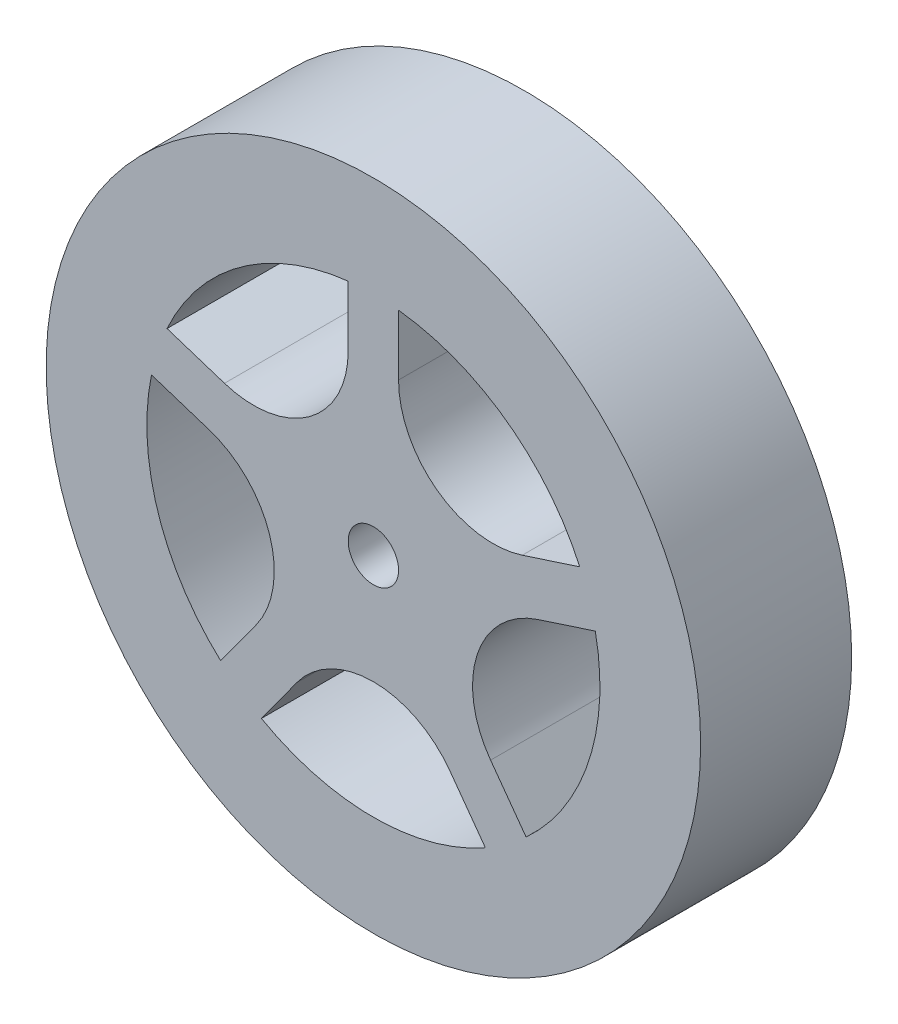
ISO-10303-21;
HEADER;
FILE_DESCRIPTION(('STEP AP214'),'2;1');
FILE_NAME('part.step','',(''),(''),'','','');
FILE_SCHEMA(('AUTOMOTIVE_DESIGN { 1 0 10303 214 1 1 1 1 }'));
ENDSEC;
DATA;
#1=APPLICATION_CONTEXT('core data for automotive mechanical design processes');
#2=APPLICATION_PROTOCOL_DEFINITION('international standard','automotive_design',2000,#1);
#3=PRODUCT_CONTEXT('',#1,'mechanical');
#4=PRODUCT('Part','Part','',(#3));
#5=PRODUCT_RELATED_PRODUCT_CATEGORY('part','',(#4));
#6=PRODUCT_DEFINITION_FORMATION('','',#4);
#7=PRODUCT_DEFINITION_CONTEXT('part definition',#1,'design');
#8=PRODUCT_DEFINITION('design','',#6,#7);
#9=PRODUCT_DEFINITION_SHAPE('','',#8);
#10=(LENGTH_UNIT() NAMED_UNIT(*) SI_UNIT(.MILLI.,.METRE.));
#11=(NAMED_UNIT(*) PLANE_ANGLE_UNIT() SI_UNIT($,.RADIAN.));
#12=(NAMED_UNIT(*) SI_UNIT($,.STERADIAN.) SOLID_ANGLE_UNIT());
#13=UNCERTAINTY_MEASURE_WITH_UNIT(LENGTH_MEASURE(1.E-05),#10,'distance_accuracy_value','');
#14=(GEOMETRIC_REPRESENTATION_CONTEXT(3) GLOBAL_UNCERTAINTY_ASSIGNED_CONTEXT((#13)) GLOBAL_UNIT_ASSIGNED_CONTEXT((#10,
#11,#12)) REPRESENTATION_CONTEXT('',''));
#15=CARTESIAN_POINT('',(0.,0.,0.));
#16=DIRECTION('',(0.,0.,1.));
#17=DIRECTION('',(1.,0.,0.));
#18=AXIS2_PLACEMENT_3D('',#15,#16,#17);
#19=CARTESIAN_POINT('',(0.,0.,15.));
#20=DIRECTION('',(0.,0.,1.));
#21=DIRECTION('',(1.,0.,0.));
#22=AXIS2_PLACEMENT_3D('',#19,#20,#21);
#23=PLANE('',#22);
#24=CARTESIAN_POINT('',(0.,0.,15.));
#25=DIRECTION('',(0.,0.,1.));
#26=DIRECTION('',(1.,0.,0.));
#27=AXIS2_PLACEMENT_3D('',#24,#25,#26);
#28=CIRCLE('',#27,32.5);
#29=CARTESIAN_POINT('',(32.5,0.,15.));
#30=VERTEX_POINT('',#29);
#31=EDGE_CURVE('E11',#30,#30,#28,.T.);
#32=ORIENTED_EDGE('',*,*,#31,.T.);
#33=EDGE_LOOP('',(#32));
#34=FACE_BOUND('',#33,.T.);
#35=CARTESIAN_POINT('',(0.,0.,15.));
#36=DIRECTION('',(0.,0.,1.));
#37=DIRECTION('',(1.,0.,0.));
#38=AXIS2_PLACEMENT_3D('',#35,#36,#37);
#39=CIRCLE('',#38,2.5);
#40=CARTESIAN_POINT('',(2.5,0.,15.));
#41=VERTEX_POINT('',#40);
#42=EDGE_CURVE('E397',#41,#41,#39,.T.);
#43=ORIENTED_EDGE('',*,*,#42,.F.);
#44=EDGE_LOOP('',(#43));
#45=FACE_BOUND('',#44,.T.);
#46=DIRECTION('',(0.951056516295154,-0.309016994374947,0.));
#47=VECTOR('',#46,1.);
#48=CARTESIAN_POINT('',(-20.4937277228636,9.28747134698841,15.));
#49=LINE('',#48,#47);
#50=CARTESIAN_POINT('',(-20.4937277228636,9.28747134698841,15.));
#51=VERTEX_POINT('',#50);
#52=CARTESIAN_POINT('',(-14.7873886250927,7.43336938073873,15.));
#53=VERTEX_POINT('',#52);
#54=EDGE_CURVE('E357',#51,#53,#49,.T.);
#55=ORIENTED_EDGE('',*,*,#54,.F.);
#56=CARTESIAN_POINT('',(0.,0.,15.));
#57=DIRECTION('',(0.,0.,1.));
#58=DIRECTION('',(1.,0.,0.));
#59=AXIS2_PLACEMENT_3D('',#56,#57,#58);
#60=CIRCLE('',#59,22.5);
#61=CARTESIAN_POINT('',(-2.5,22.3606797749979,15.));
#62=VERTEX_POINT('',#61);
#63=EDGE_CURVE('E354',#62,#51,#60,.T.);
#64=ORIENTED_EDGE('',*,*,#63,.F.);
#65=DIRECTION('',(0.,1.,0.));
#66=VECTOR('',#65,1.);
#67=CARTESIAN_POINT('',(-2.5,22.3606797749979,15.));
#68=LINE('',#67,#66);
#69=CARTESIAN_POINT('',(-2.5,16.3606797749979,15.));
#70=VERTEX_POINT('',#69);
#71=EDGE_CURVE('E365',#70,#62,#68,.T.);
#72=ORIENTED_EDGE('',*,*,#71,.F.);
#73=CARTESIAN_POINT('',(-11.8867296436132,16.3606797749979,15.));
#74=DIRECTION('',(0.,0.,1.));
#75=DIRECTION('',(1.,0.,0.));
#76=AXIS2_PLACEMENT_3D('',#73,#74,#75);
#77=CIRCLE('',#76,9.38672964361315);
#78=EDGE_CURVE('E361',#53,#70,#77,.T.);
#79=ORIENTED_EDGE('',*,*,#78,.F.);
#80=EDGE_LOOP('',(#55,#64,#72,#79));
#81=FACE_BOUND('',#80,.T.);
#82=DIRECTION('',(0.,-1.,0.));
#83=VECTOR('',#82,1.);
#84=CARTESIAN_POINT('',(2.5,22.3606797749979,15.));
#85=LINE('',#84,#83);
#86=CARTESIAN_POINT('',(2.5,22.3606797749979,15.));
#87=VERTEX_POINT('',#86);
#88=CARTESIAN_POINT('',(2.5,16.3606797749979,15.));
#89=VERTEX_POINT('',#88);
#90=EDGE_CURVE('E314',#87,#89,#85,.T.);
#91=ORIENTED_EDGE('',*,*,#90,.F.);
#92=CARTESIAN_POINT('',(0.,0.,15.));
#93=DIRECTION('',(0.,0.,1.));
#94=DIRECTION('',(1.,0.,0.));
#95=AXIS2_PLACEMENT_3D('',#92,#93,#94);
#96=CIRCLE('',#95,22.5);
#97=CARTESIAN_POINT('',(20.4937277228636,9.28747134698841,15.));
#98=VERTEX_POINT('',#97);
#99=EDGE_CURVE('E311',#98,#87,#96,.T.);
#100=ORIENTED_EDGE('',*,*,#99,.F.);
#101=DIRECTION('',(0.951056516295154,0.309016994374947,0.));
#102=VECTOR('',#101,1.);
#103=CARTESIAN_POINT('',(20.4937277228636,9.28747134698841,15.));
#104=LINE('',#103,#102);
#105=CARTESIAN_POINT('',(14.7873886250927,7.43336938073873,15.));
#106=VERTEX_POINT('',#105);
#107=EDGE_CURVE('E322',#106,#98,#104,.T.);
#108=ORIENTED_EDGE('',*,*,#107,.F.);
#109=CARTESIAN_POINT('',(11.8867296436132,16.3606797749979,15.));
#110=DIRECTION('',(0.,0.,1.));
#111=DIRECTION('',(1.,0.,0.));
#112=AXIS2_PLACEMENT_3D('',#109,#110,#111);
#113=CIRCLE('',#112,9.38672964361315);
#114=EDGE_CURVE('E318',#89,#106,#113,.T.);
#115=ORIENTED_EDGE('',*,*,#114,.F.);
#116=EDGE_LOOP('',(#91,#100,#108,#115));
#117=FACE_BOUND('',#116,.T.);
#118=DIRECTION('',(-0.951056516295153,-0.309016994374948,0.));
#119=VECTOR('',#118,1.);
#120=CARTESIAN_POINT('',(22.0388126947384,4.53218876551264,15.));
#121=LINE('',#120,#119);
#122=CARTESIAN_POINT('',(22.0388126947384,4.53218876551264,15.));
#123=VERTEX_POINT('',#122);
#124=CARTESIAN_POINT('',(16.3324735969674,2.67808679926296,15.));
#125=VERTEX_POINT('',#124);
#126=EDGE_CURVE('E271',#123,#125,#121,.T.);
#127=ORIENTED_EDGE('',*,*,#126,.F.);
#128=CARTESIAN_POINT('',(0.,0.,15.));
#129=DIRECTION('',(0.,0.,1.));
#130=DIRECTION('',(1.,0.,0.));
#131=AXIS2_PLACEMENT_3D('',#128,#129,#130);
#132=CIRCLE('',#131,22.5);
#133=CARTESIAN_POINT('',(15.1658202889157,-16.6207068130183,15.));
#134=VERTEX_POINT('',#133);
#135=EDGE_CURVE('E268',#134,#123,#132,.T.);
#136=ORIENTED_EDGE('',*,*,#135,.F.);
#137=DIRECTION('',(0.587785252292473,-0.809016994374947,0.));
#138=VECTOR('',#137,1.);
#139=CARTESIAN_POINT('',(15.1658202889157,-16.6207068130183,15.));
#140=LINE('',#139,#138);
#141=CARTESIAN_POINT('',(11.6391087751609,-11.7666048467686,15.));
#142=VERTEX_POINT('',#141);
#143=EDGE_CURVE('E279',#142,#134,#140,.T.);
#144=ORIENTED_EDGE('',*,*,#143,.F.);
#145=CARTESIAN_POINT('',(19.233132578447,-6.24922359499622,15.));
#146=DIRECTION('',(0.,0.,1.));
#147=DIRECTION('',(-1.,0.,0.));
#148=AXIS2_PLACEMENT_3D('',#145,#146,#147);
#149=CIRCLE('',#148,9.38672964361315);
#150=EDGE_CURVE('E275',#125,#142,#149,.T.);
#151=ORIENTED_EDGE('',*,*,#150,.F.);
#152=EDGE_LOOP('',(#127,#136,#144,#151));
#153=FACE_BOUND('',#152,.T.);
#154=DIRECTION('',(-0.587785252292474,0.809016994374947,0.));
#155=VECTOR('',#154,1.);
#156=CARTESIAN_POINT('',(11.120735317041,-19.5596330744807,15.));
#157=LINE('',#156,#155);
#158=CARTESIAN_POINT('',(11.120735317041,-19.5596330744807,15.));
#159=VERTEX_POINT('',#158);
#160=CARTESIAN_POINT('',(7.59402380328613,-14.705531108231,15.));
#161=VERTEX_POINT('',#160);
#162=EDGE_CURVE('E228',#159,#161,#157,.T.);
#163=ORIENTED_EDGE('',*,*,#162,.F.);
#164=CARTESIAN_POINT('',(0.,0.,15.));
#165=DIRECTION('',(0.,0.,1.));
#166=DIRECTION('',(1.,0.,0.));
#167=AXIS2_PLACEMENT_3D('',#164,#165,#166);
#168=CIRCLE('',#167,22.5);
#169=CARTESIAN_POINT('',(-11.120735317041,-19.5596330744807,15.));
#170=VERTEX_POINT('',#169);
#171=EDGE_CURVE('E225',#170,#159,#168,.T.);
#172=ORIENTED_EDGE('',*,*,#171,.F.);
#173=DIRECTION('',(-0.587785252292473,-0.809016994374947,0.));
#174=VECTOR('',#173,1.);
#175=CARTESIAN_POINT('',(-11.120735317041,-19.5596330744807,15.));
#176=LINE('',#175,#174);
#177=CARTESIAN_POINT('',(-7.59402380328613,-14.705531108231,15.));
#178=VERTEX_POINT('',#177);
#179=EDGE_CURVE('E236',#178,#170,#176,.T.);
#180=ORIENTED_EDGE('',*,*,#179,.F.);
#181=CARTESIAN_POINT('',(0.,-20.2229123600034,15.));
#182=DIRECTION('',(0.,0.,1.));
#183=DIRECTION('',(-1.,0.,0.));
#184=AXIS2_PLACEMENT_3D('',#181,#182,#183);
#185=CIRCLE('',#184,9.38672964361315);
#186=EDGE_CURVE('E232',#161,#178,#185,.T.);
#187=ORIENTED_EDGE('',*,*,#186,.F.);
#188=EDGE_LOOP('',(#163,#172,#180,#187));
#189=FACE_BOUND('',#188,.T.);
#190=DIRECTION('',(0.587785252292473,0.809016994374947,0.));
#191=VECTOR('',#190,1.);
#192=CARTESIAN_POINT('',(-15.1658202889157,-16.6207068130183,15.));
#193=LINE('',#192,#191);
#194=CARTESIAN_POINT('',(-15.1658202889157,-16.6207068130183,15.));
#195=VERTEX_POINT('',#194);
#196=CARTESIAN_POINT('',(-11.6391087751609,-11.7666048467686,15.));
#197=VERTEX_POINT('',#196);
#198=EDGE_CURVE('E186',#195,#197,#193,.T.);
#199=ORIENTED_EDGE('',*,*,#198,.F.);
#200=CARTESIAN_POINT('',(0.,0.,15.));
#201=DIRECTION('',(0.,0.,1.));
#202=DIRECTION('',(1.,0.,0.));
#203=AXIS2_PLACEMENT_3D('',#200,#201,#202);
#204=CIRCLE('',#203,22.5);
#205=CARTESIAN_POINT('',(-22.0388126947384,4.53218876551264,15.));
#206=VERTEX_POINT('',#205);
#207=EDGE_CURVE('E177',#206,#195,#204,.T.);
#208=ORIENTED_EDGE('',*,*,#207,.F.);
#209=DIRECTION('',(-0.951056516295154,0.309016994374947,0.));
#210=VECTOR('',#209,1.);
#211=CARTESIAN_POINT('',(-22.0388126947384,4.53218876551264,15.));
#212=LINE('',#211,#210);
#213=CARTESIAN_POINT('',(-16.3324735969674,2.67808679926296,15.));
#214=VERTEX_POINT('',#213);
#215=EDGE_CURVE('E203',#214,#206,#212,.T.);
#216=ORIENTED_EDGE('',*,*,#215,.F.);
#217=CARTESIAN_POINT('',(-19.233132578447,-6.24922359499622,15.));
#218=DIRECTION('',(0.,0.,1.));
#219=DIRECTION('',(-1.,0.,0.));
#220=AXIS2_PLACEMENT_3D('',#217,#218,#219);
#221=CIRCLE('',#220,9.38672964361315);
#222=EDGE_CURVE('E199',#197,#214,#221,.T.);
#223=ORIENTED_EDGE('',*,*,#222,.F.);
#224=EDGE_LOOP('',(#199,#208,#216,#223));
#225=FACE_BOUND('',#224,.T.);
#226=ADVANCED_FACE('F39',(#34,#45,#81,#117,#153,#189,#225),#23,.T.);
#227=CARTESIAN_POINT('',(0.,0.,0.));
#228=DIRECTION('',(0.,0.,1.));
#229=DIRECTION('',(1.,0.,0.));
#230=AXIS2_PLACEMENT_3D('',#227,#228,#229);
#231=PLANE('',#230);
#232=CARTESIAN_POINT('',(0.,0.,0.));
#233=DIRECTION('',(0.,0.,1.));
#234=DIRECTION('',(1.,0.,0.));
#235=AXIS2_PLACEMENT_3D('',#232,#233,#234);
#236=CIRCLE('',#235,22.5);
#237=CARTESIAN_POINT('',(-11.120735317041,-19.5596330744807,0.));
#238=VERTEX_POINT('',#237);
#239=CARTESIAN_POINT('',(11.120735317041,-19.5596330744807,0.));
#240=VERTEX_POINT('',#239);
#241=EDGE_CURVE('E195',#238,#240,#236,.T.);
#242=ORIENTED_EDGE('',*,*,#241,.T.);
#243=DIRECTION('',(-0.587785252292474,0.809016994374947,0.));
#244=VECTOR('',#243,1.);
#245=CARTESIAN_POINT('',(11.120735317041,-19.5596330744807,0.));
#246=LINE('',#245,#244);
#247=CARTESIAN_POINT('',(7.59402380328613,-14.705531108231,0.));
#248=VERTEX_POINT('',#247);
#249=EDGE_CURVE('E243',#240,#248,#246,.T.);
#250=ORIENTED_EDGE('',*,*,#249,.T.);
#251=CARTESIAN_POINT('',(0.,-20.2229123600034,0.));
#252=DIRECTION('',(0.,0.,1.));
#253=DIRECTION('',(-1.,0.,0.));
#254=AXIS2_PLACEMENT_3D('',#251,#252,#253);
#255=CIRCLE('',#254,9.38672964361315);
#256=CARTESIAN_POINT('',(-7.59402380328613,-14.705531108231,0.));
#257=VERTEX_POINT('',#256);
#258=EDGE_CURVE('E247',#248,#257,#255,.T.);
#259=ORIENTED_EDGE('',*,*,#258,.T.);
#260=DIRECTION('',(-0.587785252292473,-0.809016994374947,0.));
#261=VECTOR('',#260,1.);
#262=CARTESIAN_POINT('',(-11.120735317041,-19.5596330744807,0.));
#263=LINE('',#262,#261);
#264=EDGE_CURVE('E229',#257,#238,#263,.T.);
#265=ORIENTED_EDGE('',*,*,#264,.T.);
#266=EDGE_LOOP('',(#242,#250,#259,#265));
#267=FACE_BOUND('',#266,.T.);
#268=CARTESIAN_POINT('',(0.,0.,0.));
#269=DIRECTION('',(0.,0.,1.));
#270=DIRECTION('',(1.,0.,0.));
#271=AXIS2_PLACEMENT_3D('',#268,#269,#270);
#272=CIRCLE('',#271,22.5);
#273=CARTESIAN_POINT('',(20.4937277228636,9.28747134698841,0.));
#274=VERTEX_POINT('',#273);
#275=CARTESIAN_POINT('',(2.5,22.3606797749979,0.));
#276=VERTEX_POINT('',#275);
#277=EDGE_CURVE('E310',#274,#276,#272,.T.);
#278=ORIENTED_EDGE('',*,*,#277,.T.);
#279=DIRECTION('',(0.,-1.,0.));
#280=VECTOR('',#279,1.);
#281=CARTESIAN_POINT('',(2.5,22.3606797749979,0.));
#282=LINE('',#281,#280);
#283=CARTESIAN_POINT('',(2.5,16.3606797749979,0.));
#284=VERTEX_POINT('',#283);
#285=EDGE_CURVE('E329',#276,#284,#282,.T.);
#286=ORIENTED_EDGE('',*,*,#285,.T.);
#287=CARTESIAN_POINT('',(11.8867296436132,16.3606797749979,0.));
#288=DIRECTION('',(0.,0.,1.));
#289=DIRECTION('',(1.,0.,0.));
#290=AXIS2_PLACEMENT_3D('',#287,#288,#289);
#291=CIRCLE('',#290,9.38672964361315);
#292=CARTESIAN_POINT('',(14.7873886250927,7.43336938073873,0.));
#293=VERTEX_POINT('',#292);
#294=EDGE_CURVE('E333',#284,#293,#291,.T.);
#295=ORIENTED_EDGE('',*,*,#294,.T.);
#296=DIRECTION('',(0.951056516295154,0.309016994374947,0.));
#297=VECTOR('',#296,1.);
#298=CARTESIAN_POINT('',(20.4937277228636,9.28747134698841,0.));
#299=LINE('',#298,#297);
#300=EDGE_CURVE('E315',#293,#274,#299,.T.);
#301=ORIENTED_EDGE('',*,*,#300,.T.);
#302=EDGE_LOOP('',(#278,#286,#295,#301));
#303=FACE_BOUND('',#302,.T.);
#304=CARTESIAN_POINT('',(0.,0.,0.));
#305=DIRECTION('',(0.,0.,1.));
#306=DIRECTION('',(1.,0.,0.));
#307=AXIS2_PLACEMENT_3D('',#304,#305,#306);
#308=CIRCLE('',#307,2.5);
#309=CARTESIAN_POINT('',(2.5,0.,0.));
#310=VERTEX_POINT('',#309);
#311=EDGE_CURVE('E396',#310,#310,#308,.T.);
#312=ORIENTED_EDGE('',*,*,#311,.T.);
#313=EDGE_LOOP('',(#312));
#314=FACE_BOUND('',#313,.T.);
#315=CARTESIAN_POINT('',(0.,0.,0.));
#316=DIRECTION('',(0.,0.,1.));
#317=DIRECTION('',(1.,0.,0.));
#318=AXIS2_PLACEMENT_3D('',#315,#316,#317);
#319=CIRCLE('',#318,32.5);
#320=CARTESIAN_POINT('',(32.5,0.,0.));
#321=VERTEX_POINT('',#320);
#322=EDGE_CURVE('E43',#321,#321,#319,.T.);
#323=ORIENTED_EDGE('',*,*,#322,.F.);
#324=EDGE_LOOP('',(#323));
#325=FACE_BOUND('',#324,.T.);
#326=CARTESIAN_POINT('',(0.,0.,0.));
#327=DIRECTION('',(0.,0.,1.));
#328=DIRECTION('',(1.,0.,0.));
#329=AXIS2_PLACEMENT_3D('',#326,#327,#328);
#330=CIRCLE('',#329,22.5);
#331=CARTESIAN_POINT('',(-2.5,22.3606797749979,0.));
#332=VERTEX_POINT('',#331);
#333=CARTESIAN_POINT('',(-20.4937277228636,9.28747134698841,0.));
#334=VERTEX_POINT('',#333);
#335=EDGE_CURVE('E353',#332,#334,#330,.T.);
#336=ORIENTED_EDGE('',*,*,#335,.T.);
#337=DIRECTION('',(0.951056516295154,-0.309016994374947,0.));
#338=VECTOR('',#337,1.);
#339=CARTESIAN_POINT('',(-20.4937277228636,9.28747134698841,0.));
#340=LINE('',#339,#338);
#341=CARTESIAN_POINT('',(-14.7873886250927,7.43336938073873,0.));
#342=VERTEX_POINT('',#341);
#343=EDGE_CURVE('E372',#334,#342,#340,.T.);
#344=ORIENTED_EDGE('',*,*,#343,.T.);
#345=CARTESIAN_POINT('',(-11.8867296436132,16.3606797749979,0.));
#346=DIRECTION('',(0.,0.,1.));
#347=DIRECTION('',(1.,0.,0.));
#348=AXIS2_PLACEMENT_3D('',#345,#346,#347);
#349=CIRCLE('',#348,9.38672964361315);
#350=CARTESIAN_POINT('',(-2.5,16.3606797749979,0.));
#351=VERTEX_POINT('',#350);
#352=EDGE_CURVE('E376',#342,#351,#349,.T.);
#353=ORIENTED_EDGE('',*,*,#352,.T.);
#354=DIRECTION('',(0.,1.,0.));
#355=VECTOR('',#354,1.);
#356=CARTESIAN_POINT('',(-2.5,22.3606797749979,0.));
#357=LINE('',#356,#355);
#358=EDGE_CURVE('E358',#351,#332,#357,.T.);
#359=ORIENTED_EDGE('',*,*,#358,.T.);
#360=EDGE_LOOP('',(#336,#344,#353,#359));
#361=FACE_BOUND('',#360,.T.);
#362=CARTESIAN_POINT('',(0.,0.,0.));
#363=DIRECTION('',(0.,0.,1.));
#364=DIRECTION('',(1.,0.,0.));
#365=AXIS2_PLACEMENT_3D('',#362,#363,#364);
#366=CIRCLE('',#365,22.5);
#367=CARTESIAN_POINT('',(15.1658202889157,-16.6207068130183,0.));
#368=VERTEX_POINT('',#367);
#369=CARTESIAN_POINT('',(22.0388126947384,4.53218876551264,0.));
#370=VERTEX_POINT('',#369);
#371=EDGE_CURVE('E267',#368,#370,#366,.T.);
#372=ORIENTED_EDGE('',*,*,#371,.T.);
#373=DIRECTION('',(-0.951056516295153,-0.309016994374948,0.));
#374=VECTOR('',#373,1.);
#375=CARTESIAN_POINT('',(22.0388126947384,4.53218876551264,0.));
#376=LINE('',#375,#374);
#377=CARTESIAN_POINT('',(16.3324735969674,2.67808679926296,0.));
#378=VERTEX_POINT('',#377);
#379=EDGE_CURVE('E286',#370,#378,#376,.T.);
#380=ORIENTED_EDGE('',*,*,#379,.T.);
#381=CARTESIAN_POINT('',(19.233132578447,-6.24922359499622,0.));
#382=DIRECTION('',(0.,0.,1.));
#383=DIRECTION('',(-1.,0.,0.));
#384=AXIS2_PLACEMENT_3D('',#381,#382,#383);
#385=CIRCLE('',#384,9.38672964361315);
#386=CARTESIAN_POINT('',(11.6391087751609,-11.7666048467686,0.));
#387=VERTEX_POINT('',#386);
#388=EDGE_CURVE('E290',#378,#387,#385,.T.);
#389=ORIENTED_EDGE('',*,*,#388,.T.);
#390=DIRECTION('',(0.587785252292473,-0.809016994374947,0.));
#391=VECTOR('',#390,1.);
#392=CARTESIAN_POINT('',(15.1658202889157,-16.6207068130183,0.));
#393=LINE('',#392,#391);
#394=EDGE_CURVE('E272',#387,#368,#393,.T.);
#395=ORIENTED_EDGE('',*,*,#394,.T.);
#396=EDGE_LOOP('',(#372,#380,#389,#395));
#397=FACE_BOUND('',#396,.T.);
#398=CARTESIAN_POINT('',(0.,0.,0.));
#399=DIRECTION('',(0.,0.,1.));
#400=DIRECTION('',(1.,0.,0.));
#401=AXIS2_PLACEMENT_3D('',#398,#399,#400);
#402=CIRCLE('',#401,22.5);
#403=CARTESIAN_POINT('',(-22.0388126947384,4.53218876551264,0.));
#404=VERTEX_POINT('',#403);
#405=CARTESIAN_POINT('',(-15.1658202889157,-16.6207068130183,0.));
#406=VERTEX_POINT('',#405);
#407=EDGE_CURVE('E63',#404,#406,#402,.T.);
#408=ORIENTED_EDGE('',*,*,#407,.T.);
#409=DIRECTION('',(0.587785252292473,0.809016994374947,0.));
#410=VECTOR('',#409,1.);
#411=CARTESIAN_POINT('',(-15.1658202889157,-16.6207068130183,0.));
#412=LINE('',#411,#410);
#413=CARTESIAN_POINT('',(-11.6391087751609,-11.7666048467686,0.));
#414=VERTEX_POINT('',#413);
#415=EDGE_CURVE('E193',#406,#414,#412,.T.);
#416=ORIENTED_EDGE('',*,*,#415,.T.);
#417=CARTESIAN_POINT('',(-19.233132578447,-6.24922359499622,0.));
#418=DIRECTION('',(0.,0.,1.));
#419=DIRECTION('',(-1.,0.,0.));
#420=AXIS2_PLACEMENT_3D('',#417,#418,#419);
#421=CIRCLE('',#420,9.38672964361315);
#422=CARTESIAN_POINT('',(-16.3324735969674,2.67808679926296,0.));
#423=VERTEX_POINT('',#422);
#424=EDGE_CURVE('E212',#414,#423,#421,.T.);
#425=ORIENTED_EDGE('',*,*,#424,.T.);
#426=DIRECTION('',(-0.951056516295154,0.309016994374947,0.));
#427=VECTOR('',#426,1.);
#428=CARTESIAN_POINT('',(-22.0388126947384,4.53218876551264,0.));
#429=LINE('',#428,#427);
#430=EDGE_CURVE('E187',#423,#404,#429,.T.);
#431=ORIENTED_EDGE('',*,*,#430,.T.);
#432=EDGE_LOOP('',(#408,#416,#425,#431));
#433=FACE_BOUND('',#432,.T.);
#434=ADVANCED_FACE('F405',(#267,#303,#314,#325,#361,#397,#433),#231,.F.);
#435=CARTESIAN_POINT('',(0.,0.,15.));
#436=DIRECTION('',(0.,0.,-1.));
#437=DIRECTION('',(-1.,0.,0.));
#438=AXIS2_PLACEMENT_3D('',#435,#436,#437);
#439=CYLINDRICAL_SURFACE('',#438,32.5);
#440=ORIENTED_EDGE('',*,*,#31,.F.);
#441=EDGE_LOOP('',(#440));
#442=FACE_BOUND('',#441,.T.);
#443=ORIENTED_EDGE('',*,*,#322,.T.);
#444=EDGE_LOOP('',(#443));
#445=FACE_BOUND('',#444,.T.);
#446=ADVANCED_FACE('F41',(#442,#445),#439,.T.);
#447=CARTESIAN_POINT('',(0.,0.,15.));
#448=DIRECTION('',(0.,0.,-1.));
#449=DIRECTION('',(-1.,0.,0.));
#450=AXIS2_PLACEMENT_3D('',#447,#448,#449);
#451=CYLINDRICAL_SURFACE('',#450,2.5);
#452=ORIENTED_EDGE('',*,*,#42,.T.);
#453=EDGE_LOOP('',(#452));
#454=FACE_BOUND('',#453,.T.);
#455=ORIENTED_EDGE('',*,*,#311,.F.);
#456=EDGE_LOOP('',(#455));
#457=FACE_BOUND('',#456,.T.);
#458=ADVANCED_FACE('F408',(#454,#457),#451,.F.);
#459=CARTESIAN_POINT('',(0.,0.,15.));
#460=DIRECTION('',(0.,0.,-1.));
#461=DIRECTION('',(-1.,0.,0.));
#462=AXIS2_PLACEMENT_3D('',#459,#460,#461);
#463=CYLINDRICAL_SURFACE('',#462,22.5);
#464=ORIENTED_EDGE('',*,*,#335,.F.);
#465=DIRECTION('',(0.,0.,-1.));
#466=VECTOR('',#465,1.);
#467=CARTESIAN_POINT('',(-2.5,22.3606797749979,15.));
#468=LINE('',#467,#466);
#469=EDGE_CURVE('E368',#62,#332,#468,.T.);
#470=ORIENTED_EDGE('',*,*,#469,.F.);
#471=ORIENTED_EDGE('',*,*,#63,.T.);
#472=DIRECTION('',(0.,0.,-1.));
#473=VECTOR('',#472,1.);
#474=CARTESIAN_POINT('',(-20.4937277228636,9.28747134698841,15.));
#475=LINE('',#474,#473);
#476=EDGE_CURVE('E392',#51,#334,#475,.T.);
#477=ORIENTED_EDGE('',*,*,#476,.T.);
#478=EDGE_LOOP('',(#464,#470,#471,#477));
#479=FACE_BOUND('',#478,.T.);
#480=ADVANCED_FACE('F410',(#479),#463,.F.);
#481=CARTESIAN_POINT('',(-20.4937277228636,9.28747134698841,15.));
#482=DIRECTION('',(0.309016994374947,0.951056516295154,0.));
#483=DIRECTION('',(-0.951056516295154,0.309016994374947,0.));
#484=AXIS2_PLACEMENT_3D('',#481,#482,#483);
#485=PLANE('',#484);
#486=ORIENTED_EDGE('',*,*,#343,.F.);
#487=ORIENTED_EDGE('',*,*,#476,.F.);
#488=ORIENTED_EDGE('',*,*,#54,.T.);
#489=DIRECTION('',(0.,0.,-1.));
#490=VECTOR('',#489,1.);
#491=CARTESIAN_POINT('',(-14.7873886250927,7.43336938073873,15.));
#492=LINE('',#491,#490);
#493=EDGE_CURVE('E389',#53,#342,#492,.T.);
#494=ORIENTED_EDGE('',*,*,#493,.T.);
#495=EDGE_LOOP('',(#486,#487,#488,#494));
#496=FACE_BOUND('',#495,.T.);
#497=ADVANCED_FACE('F417',(#496),#485,.T.);
#498=CARTESIAN_POINT('',(-11.8867296436132,16.3606797749979,15.));
#499=DIRECTION('',(0.,0.,-1.));
#500=DIRECTION('',(-1.,0.,0.));
#501=AXIS2_PLACEMENT_3D('',#498,#499,#500);
#502=CYLINDRICAL_SURFACE('',#501,9.38672964361315);
#503=ORIENTED_EDGE('',*,*,#352,.F.);
#504=ORIENTED_EDGE('',*,*,#493,.F.);
#505=ORIENTED_EDGE('',*,*,#78,.T.);
#506=DIRECTION('',(0.,0.,-1.));
#507=VECTOR('',#506,1.);
#508=CARTESIAN_POINT('',(-2.5,16.3606797749979,15.));
#509=LINE('',#508,#507);
#510=EDGE_CURVE('E386',#70,#351,#509,.T.);
#511=ORIENTED_EDGE('',*,*,#510,.T.);
#512=EDGE_LOOP('',(#503,#504,#505,#511));
#513=FACE_BOUND('',#512,.T.);
#514=ADVANCED_FACE('F511',(#513),#502,.F.);
#515=CARTESIAN_POINT('',(-2.5,22.3606797749979,15.));
#516=DIRECTION('',(-1.,0.,0.));
#517=DIRECTION('',(0.,0.,1.));
#518=AXIS2_PLACEMENT_3D('',#515,#516,#517);
#519=PLANE('',#518);
#520=ORIENTED_EDGE('',*,*,#358,.F.);
#521=ORIENTED_EDGE('',*,*,#510,.F.);
#522=ORIENTED_EDGE('',*,*,#71,.T.);
#523=ORIENTED_EDGE('',*,*,#469,.T.);
#524=EDGE_LOOP('',(#520,#521,#522,#523));
#525=FACE_BOUND('',#524,.T.);
#526=ADVANCED_FACE('F507',(#525),#519,.T.);
#527=CARTESIAN_POINT('',(0.,0.,15.));
#528=DIRECTION('',(0.,0.,-1.));
#529=DIRECTION('',(-1.,0.,0.));
#530=AXIS2_PLACEMENT_3D('',#527,#528,#529);
#531=CYLINDRICAL_SURFACE('',#530,22.5);
#532=ORIENTED_EDGE('',*,*,#277,.F.);
#533=DIRECTION('',(0.,0.,-1.));
#534=VECTOR('',#533,1.);
#535=CARTESIAN_POINT('',(20.4937277228636,9.28747134698841,15.));
#536=LINE('',#535,#534);
#537=EDGE_CURVE('E325',#98,#274,#536,.T.);
#538=ORIENTED_EDGE('',*,*,#537,.F.);
#539=ORIENTED_EDGE('',*,*,#99,.T.);
#540=DIRECTION('',(0.,0.,-1.));
#541=VECTOR('',#540,1.);
#542=CARTESIAN_POINT('',(2.5,22.3606797749979,15.));
#543=LINE('',#542,#541);
#544=EDGE_CURVE('E349',#87,#276,#543,.T.);
#545=ORIENTED_EDGE('',*,*,#544,.T.);
#546=EDGE_LOOP('',(#532,#538,#539,#545));
#547=FACE_BOUND('',#546,.T.);
#548=ADVANCED_FACE('F503',(#547),#531,.F.);
#549=CARTESIAN_POINT('',(2.5,22.3606797749979,15.));
#550=DIRECTION('',(1.,0.,0.));
#551=DIRECTION('',(0.,0.,-1.));
#552=AXIS2_PLACEMENT_3D('',#549,#550,#551);
#553=PLANE('',#552);
#554=ORIENTED_EDGE('',*,*,#285,.F.);
#555=ORIENTED_EDGE('',*,*,#544,.F.);
#556=ORIENTED_EDGE('',*,*,#90,.T.);
#557=DIRECTION('',(0.,0.,-1.));
#558=VECTOR('',#557,1.);
#559=CARTESIAN_POINT('',(2.5,16.3606797749979,15.));
#560=LINE('',#559,#558);
#561=EDGE_CURVE('E346',#89,#284,#560,.T.);
#562=ORIENTED_EDGE('',*,*,#561,.T.);
#563=EDGE_LOOP('',(#554,#555,#556,#562));
#564=FACE_BOUND('',#563,.T.);
#565=ADVANCED_FACE('F499',(#564),#553,.T.);
#566=CARTESIAN_POINT('',(11.8867296436132,16.3606797749979,15.));
#567=DIRECTION('',(0.,0.,-1.));
#568=DIRECTION('',(-1.,0.,0.));
#569=AXIS2_PLACEMENT_3D('',#566,#567,#568);
#570=CYLINDRICAL_SURFACE('',#569,9.38672964361315);
#571=ORIENTED_EDGE('',*,*,#294,.F.);
#572=ORIENTED_EDGE('',*,*,#561,.F.);
#573=ORIENTED_EDGE('',*,*,#114,.T.);
#574=DIRECTION('',(0.,0.,-1.));
#575=VECTOR('',#574,1.);
#576=CARTESIAN_POINT('',(14.7873886250927,7.43336938073873,15.));
#577=LINE('',#576,#575);
#578=EDGE_CURVE('E343',#106,#293,#577,.T.);
#579=ORIENTED_EDGE('',*,*,#578,.T.);
#580=EDGE_LOOP('',(#571,#572,#573,#579));
#581=FACE_BOUND('',#580,.T.);
#582=ADVANCED_FACE('F495',(#581),#570,.F.);
#583=CARTESIAN_POINT('',(20.4937277228636,9.28747134698841,15.));
#584=DIRECTION('',(-0.309016994374947,0.951056516295154,0.));
#585=DIRECTION('',(-0.951056516295154,-0.309016994374948,0.));
#586=AXIS2_PLACEMENT_3D('',#583,#584,#585);
#587=PLANE('',#586);
#588=ORIENTED_EDGE('',*,*,#300,.F.);
#589=ORIENTED_EDGE('',*,*,#578,.F.);
#590=ORIENTED_EDGE('',*,*,#107,.T.);
#591=ORIENTED_EDGE('',*,*,#537,.T.);
#592=EDGE_LOOP('',(#588,#589,#590,#591));
#593=FACE_BOUND('',#592,.T.);
#594=ADVANCED_FACE('F491',(#593),#587,.T.);
#595=CARTESIAN_POINT('',(0.,0.,15.));
#596=DIRECTION('',(0.,0.,-1.));
#597=DIRECTION('',(-1.,0.,0.));
#598=AXIS2_PLACEMENT_3D('',#595,#596,#597);
#599=CYLINDRICAL_SURFACE('',#598,22.5);
#600=ORIENTED_EDGE('',*,*,#371,.F.);
#601=DIRECTION('',(0.,0.,-1.));
#602=VECTOR('',#601,1.);
#603=CARTESIAN_POINT('',(15.1658202889157,-16.6207068130183,15.));
#604=LINE('',#603,#602);
#605=EDGE_CURVE('E282',#134,#368,#604,.T.);
#606=ORIENTED_EDGE('',*,*,#605,.F.);
#607=ORIENTED_EDGE('',*,*,#135,.T.);
#608=DIRECTION('',(0.,0.,-1.));
#609=VECTOR('',#608,1.);
#610=CARTESIAN_POINT('',(22.0388126947384,4.53218876551264,15.));
#611=LINE('',#610,#609);
#612=EDGE_CURVE('E306',#123,#370,#611,.T.);
#613=ORIENTED_EDGE('',*,*,#612,.T.);
#614=EDGE_LOOP('',(#600,#606,#607,#613));
#615=FACE_BOUND('',#614,.T.);
#616=ADVANCED_FACE('F487',(#615),#599,.F.);
#617=CARTESIAN_POINT('',(22.0388126947384,4.53218876551264,15.));
#618=DIRECTION('',(0.309016994374948,-0.951056516295153,0.));
#619=DIRECTION('',(0.951056516295154,0.309016994374948,0.));
#620=AXIS2_PLACEMENT_3D('',#617,#618,#619);
#621=PLANE('',#620);
#622=ORIENTED_EDGE('',*,*,#379,.F.);
#623=ORIENTED_EDGE('',*,*,#612,.F.);
#624=ORIENTED_EDGE('',*,*,#126,.T.);
#625=DIRECTION('',(0.,0.,-1.));
#626=VECTOR('',#625,1.);
#627=CARTESIAN_POINT('',(16.3324735969674,2.67808679926296,15.));
#628=LINE('',#627,#626);
#629=EDGE_CURVE('E303',#125,#378,#628,.T.);
#630=ORIENTED_EDGE('',*,*,#629,.T.);
#631=EDGE_LOOP('',(#622,#623,#624,#630));
#632=FACE_BOUND('',#631,.T.);
#633=ADVANCED_FACE('F483',(#632),#621,.T.);
#634=CARTESIAN_POINT('',(19.233132578447,-6.24922359499622,15.));
#635=DIRECTION('',(0.,0.,-1.));
#636=DIRECTION('',(-1.,0.,0.));
#637=AXIS2_PLACEMENT_3D('',#634,#635,#636);
#638=CYLINDRICAL_SURFACE('',#637,9.38672964361315);
#639=ORIENTED_EDGE('',*,*,#388,.F.);
#640=ORIENTED_EDGE('',*,*,#629,.F.);
#641=ORIENTED_EDGE('',*,*,#150,.T.);
#642=DIRECTION('',(0.,0.,-1.));
#643=VECTOR('',#642,1.);
#644=CARTESIAN_POINT('',(11.6391087751609,-11.7666048467686,15.));
#645=LINE('',#644,#643);
#646=EDGE_CURVE('E300',#142,#387,#645,.T.);
#647=ORIENTED_EDGE('',*,*,#646,.T.);
#648=EDGE_LOOP('',(#639,#640,#641,#647));
#649=FACE_BOUND('',#648,.T.);
#650=ADVANCED_FACE('F479',(#649),#638,.F.);
#651=CARTESIAN_POINT('',(15.1658202889157,-16.6207068130183,15.));
#652=DIRECTION('',(0.809016994374947,0.587785252292473,0.));
#653=DIRECTION('',(-0.587785252292473,0.809016994374947,0.));
#654=AXIS2_PLACEMENT_3D('',#651,#652,#653);
#655=PLANE('',#654);
#656=ORIENTED_EDGE('',*,*,#394,.F.);
#657=ORIENTED_EDGE('',*,*,#646,.F.);
#658=ORIENTED_EDGE('',*,*,#143,.T.);
#659=ORIENTED_EDGE('',*,*,#605,.T.);
#660=EDGE_LOOP('',(#656,#657,#658,#659));
#661=FACE_BOUND('',#660,.T.);
#662=ADVANCED_FACE('F476',(#661),#655,.T.);
#663=CARTESIAN_POINT('',(0.,0.,15.));
#664=DIRECTION('',(0.,0.,-1.));
#665=DIRECTION('',(-1.,0.,0.));
#666=AXIS2_PLACEMENT_3D('',#663,#664,#665);
#667=CYLINDRICAL_SURFACE('',#666,22.5);
#668=ORIENTED_EDGE('',*,*,#241,.F.);
#669=DIRECTION('',(0.,0.,-1.));
#670=VECTOR('',#669,1.);
#671=CARTESIAN_POINT('',(-11.120735317041,-19.5596330744807,15.));
#672=LINE('',#671,#670);
#673=EDGE_CURVE('E239',#170,#238,#672,.T.);
#674=ORIENTED_EDGE('',*,*,#673,.F.);
#675=ORIENTED_EDGE('',*,*,#171,.T.);
#676=DIRECTION('',(0.,0.,-1.));
#677=VECTOR('',#676,1.);
#678=CARTESIAN_POINT('',(11.120735317041,-19.5596330744807,15.));
#679=LINE('',#678,#677);
#680=EDGE_CURVE('E263',#159,#240,#679,.T.);
#681=ORIENTED_EDGE('',*,*,#680,.T.);
#682=EDGE_LOOP('',(#668,#674,#675,#681));
#683=FACE_BOUND('',#682,.T.);
#684=ADVANCED_FACE('F458',(#683),#667,.F.);
#685=CARTESIAN_POINT('',(11.120735317041,-19.5596330744807,15.));
#686=DIRECTION('',(-0.809016994374947,-0.587785252292474,0.));
#687=DIRECTION('',(0.587785252292474,-0.809016994374947,0.));
#688=AXIS2_PLACEMENT_3D('',#685,#686,#687);
#689=PLANE('',#688);
#690=ORIENTED_EDGE('',*,*,#249,.F.);
#691=ORIENTED_EDGE('',*,*,#680,.F.);
#692=ORIENTED_EDGE('',*,*,#162,.T.);
#693=DIRECTION('',(0.,0.,-1.));
#694=VECTOR('',#693,1.);
#695=CARTESIAN_POINT('',(7.59402380328613,-14.705531108231,15.));
#696=LINE('',#695,#694);
#697=EDGE_CURVE('E260',#161,#248,#696,.T.);
#698=ORIENTED_EDGE('',*,*,#697,.T.);
#699=EDGE_LOOP('',(#690,#691,#692,#698));
#700=FACE_BOUND('',#699,.T.);
#701=ADVANCED_FACE('F451',(#700),#689,.T.);
#702=CARTESIAN_POINT('',(0.,-20.2229123600034,15.));
#703=DIRECTION('',(0.,0.,-1.));
#704=DIRECTION('',(-1.,0.,0.));
#705=AXIS2_PLACEMENT_3D('',#702,#703,#704);
#706=CYLINDRICAL_SURFACE('',#705,9.38672964361315);
#707=ORIENTED_EDGE('',*,*,#258,.F.);
#708=ORIENTED_EDGE('',*,*,#697,.F.);
#709=ORIENTED_EDGE('',*,*,#186,.T.);
#710=DIRECTION('',(0.,0.,-1.));
#711=VECTOR('',#710,1.);
#712=CARTESIAN_POINT('',(-7.59402380328613,-14.705531108231,15.));
#713=LINE('',#712,#711);
#714=EDGE_CURVE('E257',#178,#257,#713,.T.);
#715=ORIENTED_EDGE('',*,*,#714,.T.);
#716=EDGE_LOOP('',(#707,#708,#709,#715));
#717=FACE_BOUND('',#716,.T.);
#718=ADVANCED_FACE('F454',(#717),#706,.F.);
#719=CARTESIAN_POINT('',(-11.120735317041,-19.5596330744807,15.));
#720=DIRECTION('',(0.809016994374947,-0.587785252292473,0.));
#721=DIRECTION('',(0.587785252292473,0.809016994374948,0.));
#722=AXIS2_PLACEMENT_3D('',#719,#720,#721);
#723=PLANE('',#722);
#724=ORIENTED_EDGE('',*,*,#264,.F.);
#725=ORIENTED_EDGE('',*,*,#714,.F.);
#726=ORIENTED_EDGE('',*,*,#179,.T.);
#727=ORIENTED_EDGE('',*,*,#673,.T.);
#728=EDGE_LOOP('',(#724,#725,#726,#727));
#729=FACE_BOUND('',#728,.T.);
#730=ADVANCED_FACE('F461',(#729),#723,.T.);
#731=CARTESIAN_POINT('',(0.,0.,15.));
#732=DIRECTION('',(0.,0.,-1.));
#733=DIRECTION('',(-1.,0.,0.));
#734=AXIS2_PLACEMENT_3D('',#731,#732,#733);
#735=CYLINDRICAL_SURFACE('',#734,22.5);
#736=ORIENTED_EDGE('',*,*,#407,.F.);
#737=DIRECTION('',(0.,0.,-1.));
#738=VECTOR('',#737,1.);
#739=CARTESIAN_POINT('',(-22.0388126947384,4.53218876551264,15.));
#740=LINE('',#739,#738);
#741=EDGE_CURVE('E181',#206,#404,#740,.T.);
#742=ORIENTED_EDGE('',*,*,#741,.F.);
#743=ORIENTED_EDGE('',*,*,#207,.T.);
#744=DIRECTION('',(0.,0.,-1.));
#745=VECTOR('',#744,1.);
#746=CARTESIAN_POINT('',(-15.1658202889157,-16.6207068130183,15.));
#747=LINE('',#746,#745);
#748=EDGE_CURVE('E180',#195,#406,#747,.T.);
#749=ORIENTED_EDGE('',*,*,#748,.T.);
#750=EDGE_LOOP('',(#736,#742,#743,#749));
#751=FACE_BOUND('',#750,.T.);
#752=ADVANCED_FACE('F179',(#751),#735,.F.);
#753=CARTESIAN_POINT('',(-15.1658202889157,-16.6207068130183,15.));
#754=DIRECTION('',(-0.809016994374947,0.587785252292473,0.));
#755=DIRECTION('',(-0.587785252292473,-0.809016994374948,0.));
#756=AXIS2_PLACEMENT_3D('',#753,#754,#755);
#757=PLANE('',#756);
#758=ORIENTED_EDGE('',*,*,#415,.F.);
#759=ORIENTED_EDGE('',*,*,#748,.F.);
#760=ORIENTED_EDGE('',*,*,#198,.T.);
#761=DIRECTION('',(0.,0.,-1.));
#762=VECTOR('',#761,1.);
#763=CARTESIAN_POINT('',(-11.6391087751609,-11.7666048467686,15.));
#764=LINE('',#763,#762);
#765=EDGE_CURVE('E196',#197,#414,#764,.T.);
#766=ORIENTED_EDGE('',*,*,#765,.T.);
#767=EDGE_LOOP('',(#758,#759,#760,#766));
#768=FACE_BOUND('',#767,.T.);
#769=ADVANCED_FACE('F190',(#768),#757,.T.);
#770=CARTESIAN_POINT('',(-19.233132578447,-6.24922359499622,15.));
#771=DIRECTION('',(0.,0.,-1.));
#772=DIRECTION('',(-1.,0.,0.));
#773=AXIS2_PLACEMENT_3D('',#770,#771,#772);
#774=CYLINDRICAL_SURFACE('',#773,9.38672964361315);
#775=ORIENTED_EDGE('',*,*,#424,.F.);
#776=ORIENTED_EDGE('',*,*,#765,.F.);
#777=ORIENTED_EDGE('',*,*,#222,.T.);
#778=DIRECTION('',(0.,0.,-1.));
#779=VECTOR('',#778,1.);
#780=CARTESIAN_POINT('',(-16.3324735969674,2.67808679926296,15.));
#781=LINE('',#780,#779);
#782=EDGE_CURVE('E55',#214,#423,#781,.T.);
#783=ORIENTED_EDGE('',*,*,#782,.T.);
#784=EDGE_LOOP('',(#775,#776,#777,#783));
#785=FACE_BOUND('',#784,.T.);
#786=ADVANCED_FACE('F532',(#785),#774,.F.);
#787=CARTESIAN_POINT('',(-22.0388126947384,4.53218876551264,15.));
#788=DIRECTION('',(-0.309016994374947,-0.951056516295154,0.));
#789=DIRECTION('',(0.951056516295154,-0.309016994374947,0.));
#790=AXIS2_PLACEMENT_3D('',#787,#788,#789);
#791=PLANE('',#790);
#792=ORIENTED_EDGE('',*,*,#430,.F.);
#793=ORIENTED_EDGE('',*,*,#782,.F.);
#794=ORIENTED_EDGE('',*,*,#215,.T.);
#795=ORIENTED_EDGE('',*,*,#741,.T.);
#796=EDGE_LOOP('',(#792,#793,#794,#795));
#797=FACE_BOUND('',#796,.T.);
#798=ADVANCED_FACE('F530',(#797),#791,.T.);
#799=CLOSED_SHELL('',(#226,#434,#446,#458,#480,#497,#514,#526,#548,#565,#582,#594,#616,#633,
#650,#662,#684,#701,#718,#730,#752,#769,#786,#798));
#800=MANIFOLD_SOLID_BREP('B2',#799);
#801=ADVANCED_BREP_SHAPE_REPRESENTATION('',(#18,#800),#14);
#802=SHAPE_DEFINITION_REPRESENTATION(#9,#801);
ENDSEC;
END-ISO-10303-21;
